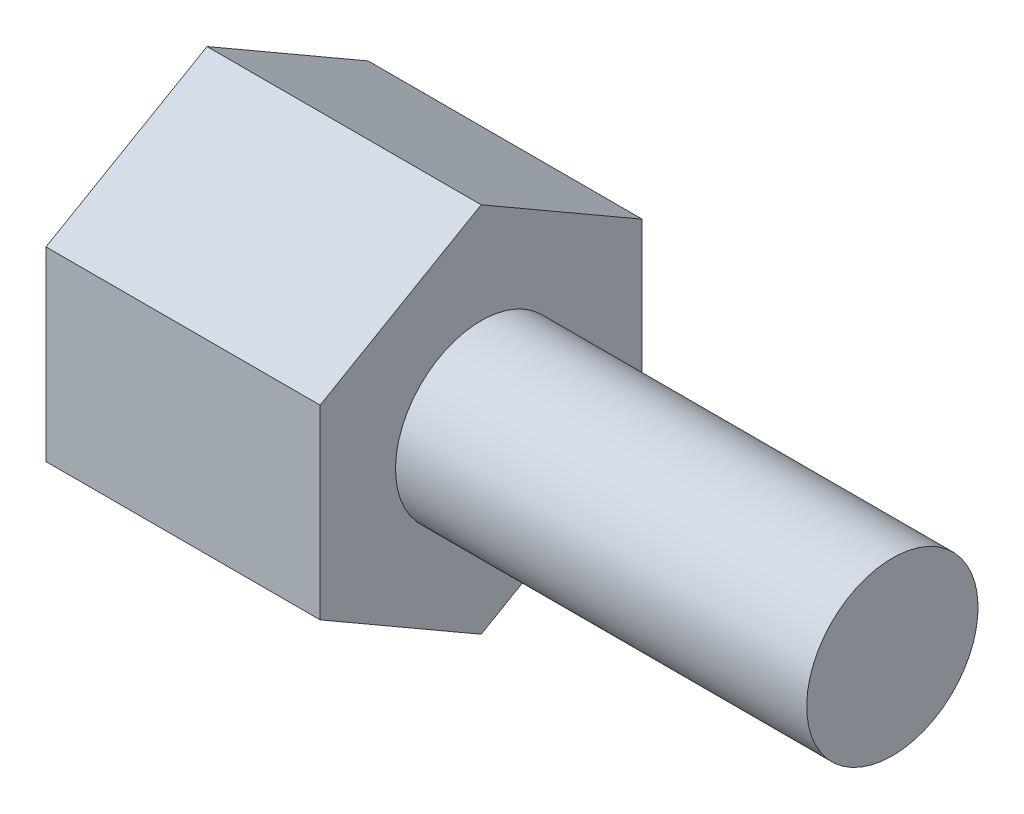
ISO-10303-21;
HEADER;
FILE_DESCRIPTION(('STEP AP214'),'2;1');
FILE_NAME('part.step','',(''),(''),'','','');
FILE_SCHEMA(('AUTOMOTIVE_DESIGN { 1 0 10303 214 1 1 1 1 }'));
ENDSEC;
DATA;
#1=APPLICATION_CONTEXT('core data for automotive mechanical design processes');
#2=APPLICATION_PROTOCOL_DEFINITION('international standard','automotive_design',2000,#1);
#3=PRODUCT_CONTEXT('',#1,'mechanical');
#4=PRODUCT('Part','Part','',(#3));
#5=PRODUCT_RELATED_PRODUCT_CATEGORY('part','',(#4));
#6=PRODUCT_DEFINITION_FORMATION('','',#4);
#7=PRODUCT_DEFINITION_CONTEXT('part definition',#1,'design');
#8=PRODUCT_DEFINITION('design','',#6,#7);
#9=PRODUCT_DEFINITION_SHAPE('','',#8);
#10=(LENGTH_UNIT() NAMED_UNIT(*) SI_UNIT(.MILLI.,.METRE.));
#11=(NAMED_UNIT(*) PLANE_ANGLE_UNIT() SI_UNIT($,.RADIAN.));
#12=(NAMED_UNIT(*) SI_UNIT($,.STERADIAN.) SOLID_ANGLE_UNIT());
#13=UNCERTAINTY_MEASURE_WITH_UNIT(LENGTH_MEASURE(1.E-05),#10,'distance_accuracy_value','');
#14=(GEOMETRIC_REPRESENTATION_CONTEXT(3) GLOBAL_UNCERTAINTY_ASSIGNED_CONTEXT((#13)) GLOBAL_UNIT_ASSIGNED_CONTEXT((#10,
#11,#12)) REPRESENTATION_CONTEXT('',''));
#15=CARTESIAN_POINT('',(0.,0.,0.));
#16=DIRECTION('',(0.,0.,1.));
#17=DIRECTION('',(1.,0.,0.));
#18=AXIS2_PLACEMENT_3D('',#15,#16,#17);
#19=CARTESIAN_POINT('',(-4.,0.,0.));
#20=DIRECTION('',(-1.,0.,0.));
#21=DIRECTION('',(0.,0.,1.));
#22=AXIS2_PLACEMENT_3D('',#19,#20,#21);
#23=PLANE('',#22);
#24=CARTESIAN_POINT('',(-4.,0.,0.));
#25=DIRECTION('',(1.,0.,0.));
#26=DIRECTION('',(0.,-1.,0.));
#27=AXIS2_PLACEMENT_3D('',#24,#25,#26);
#28=CIRCLE('',#27,1.03775);
#29=CARTESIAN_POINT('',(-4.,1.03775,0.));
#30=VERTEX_POINT('',#29);
#31=EDGE_CURVE('E195',#30,#30,#28,.T.);
#32=ORIENTED_EDGE('',*,*,#31,.T.);
#33=EDGE_LOOP('',(#32));
#34=FACE_BOUND('',#33,.T.);
#35=DIRECTION('',(0.,1.,0.));
#36=VECTOR('',#35,1.);
#37=CARTESIAN_POINT('',(-4.,1.35677313259562,2.35));
#38=LINE('',#37,#36);
#39=CARTESIAN_POINT('',(-4.,-1.35677313259562,2.35));
#40=VERTEX_POINT('',#39);
#41=CARTESIAN_POINT('',(-4.,1.35677313259562,2.35));
#42=VERTEX_POINT('',#41);
#43=EDGE_CURVE('E11',#40,#42,#38,.T.);
#44=ORIENTED_EDGE('',*,*,#43,.T.);
#45=DIRECTION('',(0.,0.5,-0.866025403784439));
#46=VECTOR('',#45,1.);
#47=CARTESIAN_POINT('',(-4.,2.71354626519124,0.));
#48=LINE('',#47,#46);
#49=CARTESIAN_POINT('',(-4.,2.71354626519124,0.));
#50=VERTEX_POINT('',#49);
#51=EDGE_CURVE('E118',#42,#50,#48,.T.);
#52=ORIENTED_EDGE('',*,*,#51,.T.);
#53=DIRECTION('',(0.,-0.5,-0.866025403784438));
#54=VECTOR('',#53,1.);
#55=CARTESIAN_POINT('',(-4.,1.35677313259562,-2.35));
#56=LINE('',#55,#54);
#57=CARTESIAN_POINT('',(-4.,1.35677313259562,-2.35));
#58=VERTEX_POINT('',#57);
#59=EDGE_CURVE('E66',#50,#58,#56,.T.);
#60=ORIENTED_EDGE('',*,*,#59,.T.);
#61=DIRECTION('',(0.,-1.,0.));
#62=VECTOR('',#61,1.);
#63=CARTESIAN_POINT('',(-4.,-1.35677313259562,-2.35));
#64=LINE('',#63,#62);
#65=CARTESIAN_POINT('',(-4.,-1.35677313259562,-2.35));
#66=VERTEX_POINT('',#65);
#67=EDGE_CURVE('E132',#58,#66,#64,.T.);
#68=ORIENTED_EDGE('',*,*,#67,.T.);
#69=DIRECTION('',(0.,-0.5,0.866025403784439));
#70=VECTOR('',#69,1.);
#71=CARTESIAN_POINT('',(-4.,-2.71354626519124,0.));
#72=LINE('',#71,#70);
#73=CARTESIAN_POINT('',(-4.,-2.71354626519124,0.));
#74=VERTEX_POINT('',#73);
#75=EDGE_CURVE('E95',#66,#74,#72,.T.);
#76=ORIENTED_EDGE('',*,*,#75,.T.);
#77=DIRECTION('',(0.,0.5,0.866025403784439));
#78=VECTOR('',#77,1.);
#79=CARTESIAN_POINT('',(-4.,-1.35677313259562,2.35));
#80=LINE('',#79,#78);
#81=EDGE_CURVE('E93',#74,#40,#80,.T.);
#82=ORIENTED_EDGE('',*,*,#81,.T.);
#83=EDGE_LOOP('',(#44,#52,#60,#68,#76,#82));
#84=FACE_BOUND('',#83,.T.);
#85=ADVANCED_FACE('F17',(#34,#84),#23,.T.);
#86=CARTESIAN_POINT('',(0.,0.,0.));
#87=DIRECTION('',(1.,0.,0.));
#88=DIRECTION('',(0.,1.,0.));
#89=AXIS2_PLACEMENT_3D('',#86,#87,#88);
#90=PLANE('',#89);
#91=CARTESIAN_POINT('',(0.,0.,0.));
#92=DIRECTION('',(-1.,0.,0.));
#93=DIRECTION('',(0.,1.,0.));
#94=AXIS2_PLACEMENT_3D('',#91,#92,#93);
#95=CIRCLE('',#94,1.25);
#96=CARTESIAN_POINT('',(0.,-1.25,0.));
#97=VERTEX_POINT('',#96);
#98=EDGE_CURVE('E198',#97,#97,#95,.T.);
#99=ORIENTED_EDGE('',*,*,#98,.T.);
#100=EDGE_LOOP('',(#99));
#101=FACE_BOUND('',#100,.T.);
#102=DIRECTION('',(0.,-1.,0.));
#103=VECTOR('',#102,1.);
#104=CARTESIAN_POINT('',(0.,1.35677313259562,2.35));
#105=LINE('',#104,#103);
#106=CARTESIAN_POINT('',(0.,1.35677313259562,2.35));
#107=VERTEX_POINT('',#106);
#108=CARTESIAN_POINT('',(0.,-1.35677313259562,2.35));
#109=VERTEX_POINT('',#108);
#110=EDGE_CURVE('E27',#107,#109,#105,.T.);
#111=ORIENTED_EDGE('',*,*,#110,.T.);
#112=DIRECTION('',(0.,-0.5,-0.866025403784439));
#113=VECTOR('',#112,1.);
#114=CARTESIAN_POINT('',(0.,-1.35677313259562,2.35));
#115=LINE('',#114,#113);
#116=CARTESIAN_POINT('',(0.,-2.71354626519124,0.));
#117=VERTEX_POINT('',#116);
#118=EDGE_CURVE('E104',#109,#117,#115,.T.);
#119=ORIENTED_EDGE('',*,*,#118,.T.);
#120=DIRECTION('',(0.,0.5,-0.866025403784439));
#121=VECTOR('',#120,1.);
#122=CARTESIAN_POINT('',(0.,-2.71354626519124,0.));
#123=LINE('',#122,#121);
#124=CARTESIAN_POINT('',(0.,-1.35677313259562,-2.35));
#125=VERTEX_POINT('',#124);
#126=EDGE_CURVE('E122',#117,#125,#123,.T.);
#127=ORIENTED_EDGE('',*,*,#126,.T.);
#128=DIRECTION('',(0.,1.,0.));
#129=VECTOR('',#128,1.);
#130=CARTESIAN_POINT('',(0.,-1.35677313259562,-2.35));
#131=LINE('',#130,#129);
#132=CARTESIAN_POINT('',(0.,1.35677313259562,-2.35));
#133=VERTEX_POINT('',#132);
#134=EDGE_CURVE('E115',#125,#133,#131,.T.);
#135=ORIENTED_EDGE('',*,*,#134,.T.);
#136=DIRECTION('',(0.,0.5,0.866025403784438));
#137=VECTOR('',#136,1.);
#138=CARTESIAN_POINT('',(0.,1.35677313259562,-2.35));
#139=LINE('',#138,#137);
#140=CARTESIAN_POINT('',(0.,2.71354626519124,0.));
#141=VERTEX_POINT('',#140);
#142=EDGE_CURVE('E138',#133,#141,#139,.T.);
#143=ORIENTED_EDGE('',*,*,#142,.T.);
#144=DIRECTION('',(0.,-0.5,0.866025403784439));
#145=VECTOR('',#144,1.);
#146=CARTESIAN_POINT('',(0.,2.71354626519124,0.));
#147=LINE('',#146,#145);
#148=EDGE_CURVE('E54',#141,#107,#147,.T.);
#149=ORIENTED_EDGE('',*,*,#148,.T.);
#150=EDGE_LOOP('',(#111,#119,#127,#135,#143,#149));
#151=FACE_BOUND('',#150,.T.);
#152=ADVANCED_FACE('F155',(#101,#151),#90,.T.);
#153=CARTESIAN_POINT('',(0.,-1.35677313259562,2.35));
#154=DIRECTION('',(0.,0.,1.));
#155=DIRECTION('',(0.,-1.,0.));
#156=AXIS2_PLACEMENT_3D('',#153,#154,#155);
#157=PLANE('',#156);
#158=ORIENTED_EDGE('',*,*,#110,.F.);
#159=DIRECTION('',(-1.,0.,0.));
#160=VECTOR('',#159,1.);
#161=CARTESIAN_POINT('',(0.,1.35677313259562,2.35));
#162=LINE('',#161,#160);
#163=EDGE_CURVE('E90',#107,#42,#162,.T.);
#164=ORIENTED_EDGE('',*,*,#163,.T.);
#165=ORIENTED_EDGE('',*,*,#43,.F.);
#166=DIRECTION('',(-1.,0.,0.));
#167=VECTOR('',#166,1.);
#168=CARTESIAN_POINT('',(0.,-1.35677313259562,2.35));
#169=LINE('',#168,#167);
#170=EDGE_CURVE('E88',#109,#40,#169,.T.);
#171=ORIENTED_EDGE('',*,*,#170,.F.);
#172=EDGE_LOOP('',(#158,#164,#165,#171));
#173=FACE_BOUND('',#172,.T.);
#174=ADVANCED_FACE('F19',(#173),#157,.T.);
#175=CARTESIAN_POINT('',(0.,1.35677313259562,2.35));
#176=DIRECTION('',(0.,0.866025403784439,0.5));
#177=DIRECTION('',(1.,0.,0.));
#178=AXIS2_PLACEMENT_3D('',#175,#176,#177);
#179=PLANE('',#178);
#180=ORIENTED_EDGE('',*,*,#148,.F.);
#181=DIRECTION('',(-1.,0.,0.));
#182=VECTOR('',#181,1.);
#183=CARTESIAN_POINT('',(0.,2.71354626519124,0.));
#184=LINE('',#183,#182);
#185=EDGE_CURVE('E144',#141,#50,#184,.T.);
#186=ORIENTED_EDGE('',*,*,#185,.T.);
#187=ORIENTED_EDGE('',*,*,#51,.F.);
#188=ORIENTED_EDGE('',*,*,#163,.F.);
#189=EDGE_LOOP('',(#180,#186,#187,#188));
#190=FACE_BOUND('',#189,.T.);
#191=ADVANCED_FACE('F157',(#190),#179,.T.);
#192=CARTESIAN_POINT('',(0.,2.71354626519124,0.));
#193=DIRECTION('',(0.,0.866025403784438,-0.5));
#194=DIRECTION('',(-1.,0.,0.));
#195=AXIS2_PLACEMENT_3D('',#192,#193,#194);
#196=PLANE('',#195);
#197=ORIENTED_EDGE('',*,*,#142,.F.);
#198=DIRECTION('',(-1.,0.,0.));
#199=VECTOR('',#198,1.);
#200=CARTESIAN_POINT('',(0.,1.35677313259562,-2.35));
#201=LINE('',#200,#199);
#202=EDGE_CURVE('E135',#133,#58,#201,.T.);
#203=ORIENTED_EDGE('',*,*,#202,.T.);
#204=ORIENTED_EDGE('',*,*,#59,.F.);
#205=ORIENTED_EDGE('',*,*,#185,.F.);
#206=EDGE_LOOP('',(#197,#203,#204,#205));
#207=FACE_BOUND('',#206,.T.);
#208=ADVANCED_FACE('F159',(#207),#196,.T.);
#209=CARTESIAN_POINT('',(0.,1.35677313259562,-2.35));
#210=DIRECTION('',(0.,0.,-1.));
#211=DIRECTION('',(0.,-1.,0.));
#212=AXIS2_PLACEMENT_3D('',#209,#210,#211);
#213=PLANE('',#212);
#214=ORIENTED_EDGE('',*,*,#134,.F.);
#215=DIRECTION('',(-1.,0.,0.));
#216=VECTOR('',#215,1.);
#217=CARTESIAN_POINT('',(0.,-1.35677313259562,-2.35));
#218=LINE('',#217,#216);
#219=EDGE_CURVE('E126',#125,#66,#218,.T.);
#220=ORIENTED_EDGE('',*,*,#219,.T.);
#221=ORIENTED_EDGE('',*,*,#67,.F.);
#222=ORIENTED_EDGE('',*,*,#202,.F.);
#223=EDGE_LOOP('',(#214,#220,#221,#222));
#224=FACE_BOUND('',#223,.T.);
#225=ADVANCED_FACE('F165',(#224),#213,.T.);
#226=CARTESIAN_POINT('',(0.,-1.35677313259562,-2.35));
#227=DIRECTION('',(0.,-0.866025403784439,-0.5));
#228=DIRECTION('',(0.,0.5,-0.866025403784439));
#229=AXIS2_PLACEMENT_3D('',#226,#227,#228);
#230=PLANE('',#229);
#231=ORIENTED_EDGE('',*,*,#126,.F.);
#232=DIRECTION('',(-1.,0.,0.));
#233=VECTOR('',#232,1.);
#234=CARTESIAN_POINT('',(0.,-2.71354626519124,0.));
#235=LINE('',#234,#233);
#236=EDGE_CURVE('E100',#117,#74,#235,.T.);
#237=ORIENTED_EDGE('',*,*,#236,.T.);
#238=ORIENTED_EDGE('',*,*,#75,.F.);
#239=ORIENTED_EDGE('',*,*,#219,.F.);
#240=EDGE_LOOP('',(#231,#237,#238,#239));
#241=FACE_BOUND('',#240,.T.);
#242=ADVANCED_FACE('F224',(#241),#230,.T.);
#243=CARTESIAN_POINT('',(0.,-2.71354626519124,0.));
#244=DIRECTION('',(0.,-0.866025403784439,0.5));
#245=DIRECTION('',(-1.,0.,0.));
#246=AXIS2_PLACEMENT_3D('',#243,#244,#245);
#247=PLANE('',#246);
#248=ORIENTED_EDGE('',*,*,#118,.F.);
#249=ORIENTED_EDGE('',*,*,#170,.T.);
#250=ORIENTED_EDGE('',*,*,#81,.F.);
#251=ORIENTED_EDGE('',*,*,#236,.F.);
#252=EDGE_LOOP('',(#248,#249,#250,#251));
#253=FACE_BOUND('',#252,.T.);
#254=ADVANCED_FACE('F102',(#253),#247,.T.);
#255=CARTESIAN_POINT('',(-1.,0.,0.));
#256=DIRECTION('',(1.,0.,0.));
#257=DIRECTION('',(0.,1.,0.));
#258=AXIS2_PLACEMENT_3D('',#255,#256,#257);
#259=PLANE('',#258);
#260=CARTESIAN_POINT('',(-1.,0.,0.));
#261=DIRECTION('',(1.,0.,0.));
#262=DIRECTION('',(0.,-1.,0.));
#263=AXIS2_PLACEMENT_3D('',#260,#261,#262);
#264=CIRCLE('',#263,1.03775);
#265=CARTESIAN_POINT('',(-1.,1.03775,0.));
#266=VERTEX_POINT('',#265);
#267=EDGE_CURVE('E111',#266,#266,#264,.T.);
#268=ORIENTED_EDGE('',*,*,#267,.F.);
#269=EDGE_LOOP('',(#268));
#270=FACE_BOUND('',#269,.T.);
#271=ADVANCED_FACE('F219',(#270),#259,.F.);
#272=CARTESIAN_POINT('',(-2.5,0.,0.));
#273=DIRECTION('',(1.,0.,0.));
#274=DIRECTION('',(0.,-1.,0.));
#275=AXIS2_PLACEMENT_3D('',#272,#273,#274);
#276=CYLINDRICAL_SURFACE('',#275,1.03775);
#277=ORIENTED_EDGE('',*,*,#31,.F.);
#278=DIRECTION('',(1.,0.,0.));
#279=VECTOR('',#278,1.);
#280=CARTESIAN_POINT('',(-2.5,1.03775,0.));
#281=LINE('',#280,#279);
#282=EDGE_CURVE('E187',#30,#266,#281,.T.);
#283=ORIENTED_EDGE('',*,*,#282,.T.);
#284=ORIENTED_EDGE('',*,*,#267,.T.);
#285=ORIENTED_EDGE('',*,*,#282,.F.);
#286=EDGE_LOOP('',(#277,#283,#284,#285));
#287=FACE_BOUND('',#286,.T.);
#288=ADVANCED_FACE('F186',(#287),#276,.F.);
#289=CARTESIAN_POINT('',(6.,0.,0.));
#290=DIRECTION('',(1.,0.,0.));
#291=DIRECTION('',(0.,1.,0.));
#292=AXIS2_PLACEMENT_3D('',#289,#290,#291);
#293=PLANE('',#292);
#294=CARTESIAN_POINT('',(6.,0.,0.));
#295=DIRECTION('',(1.,0.,0.));
#296=DIRECTION('',(0.,1.,0.));
#297=AXIS2_PLACEMENT_3D('',#294,#295,#296);
#298=CIRCLE('',#297,1.25);
#299=CARTESIAN_POINT('',(6.,-1.25,0.));
#300=VERTEX_POINT('',#299);
#301=EDGE_CURVE('E307',#300,#300,#298,.T.);
#302=ORIENTED_EDGE('',*,*,#301,.T.);
#303=EDGE_LOOP('',(#302));
#304=FACE_BOUND('',#303,.T.);
#305=ADVANCED_FACE('F316',(#304),#293,.T.);
#306=CARTESIAN_POINT('',(0.,0.,0.));
#307=DIRECTION('',(1.,0.,0.));
#308=DIRECTION('',(0.,1.,0.));
#309=AXIS2_PLACEMENT_3D('',#306,#307,#308);
#310=CYLINDRICAL_SURFACE('',#309,1.25);
#311=ORIENTED_EDGE('',*,*,#301,.F.);
#312=DIRECTION('',(-1.,0.,0.));
#313=VECTOR('',#312,1.);
#314=CARTESIAN_POINT('',(0.,-1.25,0.));
#315=LINE('',#314,#313);
#316=EDGE_CURVE('E202',#300,#97,#315,.T.);
#317=ORIENTED_EDGE('',*,*,#316,.T.);
#318=ORIENTED_EDGE('',*,*,#98,.F.);
#319=ORIENTED_EDGE('',*,*,#316,.F.);
#320=EDGE_LOOP('',(#311,#317,#318,#319));
#321=FACE_BOUND('',#320,.T.);
#322=ADVANCED_FACE('F305',(#321),#310,.T.);
#323=CLOSED_SHELL('',(#85,#152,#174,#191,#208,#225,#242,#254,#271,#288,#305,#322));
#324=MANIFOLD_SOLID_BREP('B1',#323);
#325=ADVANCED_BREP_SHAPE_REPRESENTATION('',(#18,#324),#14);
#326=SHAPE_DEFINITION_REPRESENTATION(#9,#325);
ENDSEC;
END-ISO-10303-21;
